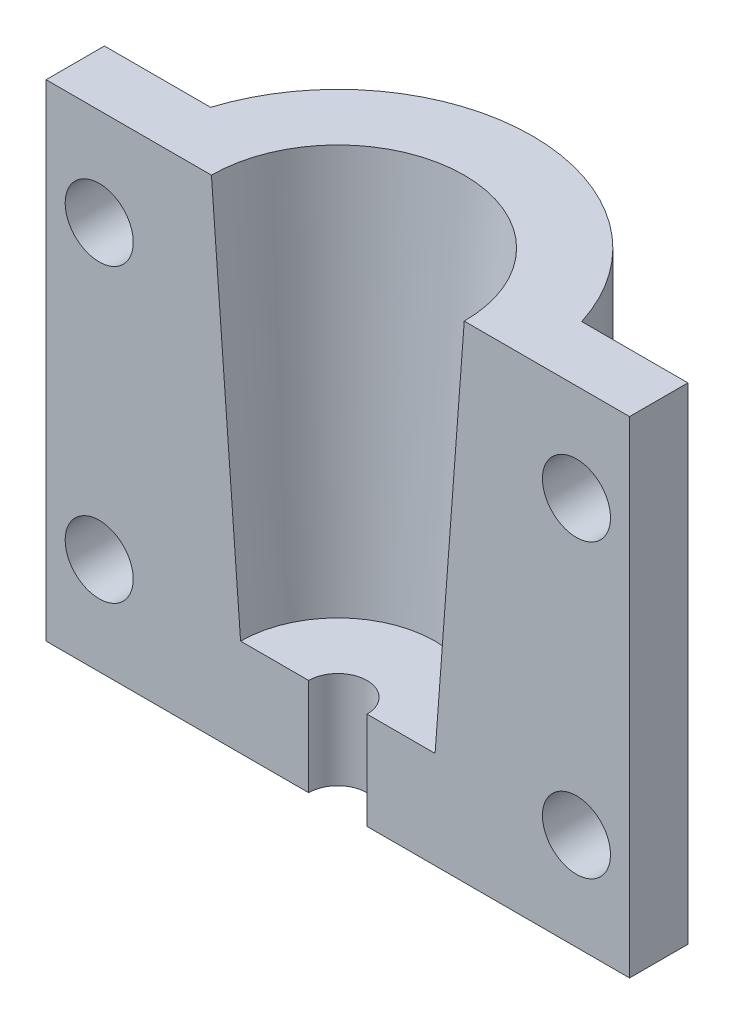
ISO-10303-21;
HEADER;
FILE_DESCRIPTION(('STEP AP214'),'2;1');
FILE_NAME('part.step','',(''),(''),'','','');
FILE_SCHEMA(('AUTOMOTIVE_DESIGN { 1 0 10303 214 1 1 1 1 }'));
ENDSEC;
DATA;
#1=APPLICATION_CONTEXT('core data for automotive mechanical design processes');
#2=APPLICATION_PROTOCOL_DEFINITION('international standard','automotive_design',2000,#1);
#3=PRODUCT_CONTEXT('',#1,'mechanical');
#4=PRODUCT('Part','Part','',(#3));
#5=PRODUCT_RELATED_PRODUCT_CATEGORY('part','',(#4));
#6=PRODUCT_DEFINITION_FORMATION('','',#4);
#7=PRODUCT_DEFINITION_CONTEXT('part definition',#1,'design');
#8=PRODUCT_DEFINITION('design','',#6,#7);
#9=PRODUCT_DEFINITION_SHAPE('','',#8);
#10=(LENGTH_UNIT() NAMED_UNIT(*) SI_UNIT(.MILLI.,.METRE.));
#11=(NAMED_UNIT(*) PLANE_ANGLE_UNIT() SI_UNIT($,.RADIAN.));
#12=(NAMED_UNIT(*) SI_UNIT($,.STERADIAN.) SOLID_ANGLE_UNIT());
#13=UNCERTAINTY_MEASURE_WITH_UNIT(LENGTH_MEASURE(1.E-05),#10,'distance_accuracy_value','');
#14=(GEOMETRIC_REPRESENTATION_CONTEXT(3) GLOBAL_UNCERTAINTY_ASSIGNED_CONTEXT((#13)) GLOBAL_UNIT_ASSIGNED_CONTEXT((#10,
#11,#12)) REPRESENTATION_CONTEXT('',''));
#15=CARTESIAN_POINT('',(0.,0.,0.));
#16=DIRECTION('',(0.,0.,1.));
#17=DIRECTION('',(1.,0.,0.));
#18=AXIS2_PLACEMENT_3D('',#15,#16,#17);
#19=CARTESIAN_POINT('',(0.,25.,0.));
#20=DIRECTION('',(0.,-1.,0.));
#21=DIRECTION('',(0.,0.,-1.));
#22=AXIS2_PLACEMENT_3D('',#19,#20,#21);
#23=CYLINDRICAL_SURFACE('',#22,10.);
#24=CARTESIAN_POINT('',(0.,25.,0.));
#25=DIRECTION('',(0.,1.,0.));
#26=DIRECTION('',(0.,0.,1.));
#27=AXIS2_PLACEMENT_3D('',#24,#25,#26);
#28=CIRCLE('',#27,10.);
#29=CARTESIAN_POINT('',(9.53939201416946,25.,-3.));
#30=VERTEX_POINT('',#29);
#31=CARTESIAN_POINT('',(-9.53939201416946,25.,-3.));
#32=VERTEX_POINT('',#31);
#33=EDGE_CURVE('E12',#30,#32,#28,.T.);
#34=ORIENTED_EDGE('',*,*,#33,.F.);
#35=DIRECTION('',(0.,-1.,0.));
#36=VECTOR('',#35,1.);
#37=CARTESIAN_POINT('',(9.53939201416946,25.,-3.));
#38=LINE('',#37,#36);
#39=CARTESIAN_POINT('',(9.53939201416946,0.,-3.));
#40=VERTEX_POINT('',#39);
#41=EDGE_CURVE('E165',#30,#40,#38,.T.);
#42=ORIENTED_EDGE('',*,*,#41,.T.);
#43=CARTESIAN_POINT('',(0.,0.,0.));
#44=DIRECTION('',(0.,1.,0.));
#45=DIRECTION('',(0.,0.,1.));
#46=AXIS2_PLACEMENT_3D('',#43,#44,#45);
#47=CIRCLE('',#46,10.);
#48=CARTESIAN_POINT('',(-9.53939201416946,0.,-3.));
#49=VERTEX_POINT('',#48);
#50=EDGE_CURVE('E76',#40,#49,#47,.T.);
#51=ORIENTED_EDGE('',*,*,#50,.T.);
#52=DIRECTION('',(0.,-1.,0.));
#53=VECTOR('',#52,1.);
#54=CARTESIAN_POINT('',(-9.53939201416946,25.,-3.));
#55=LINE('',#54,#53);
#56=EDGE_CURVE('E154',#32,#49,#55,.T.);
#57=ORIENTED_EDGE('',*,*,#56,.F.);
#58=EDGE_LOOP('',(#34,#42,#51,#57));
#59=FACE_BOUND('',#58,.T.);
#60=ADVANCED_FACE('F66',(#59),#23,.T.);
#61=CARTESIAN_POINT('',(0.,25.,0.));
#62=DIRECTION('',(0.,1.,0.));
#63=DIRECTION('',(0.,0.,1.));
#64=AXIS2_PLACEMENT_3D('',#61,#62,#63);
#65=PLANE('',#64);
#66=CARTESIAN_POINT('',(0.,25.,0.));
#67=DIRECTION('',(0.,1.,0.));
#68=DIRECTION('',(0.,0.,1.));
#69=AXIS2_PLACEMENT_3D('',#66,#67,#68);
#70=CIRCLE('',#69,6.5);
#71=CARTESIAN_POINT('',(-6.5,25.,0.));
#72=VERTEX_POINT('',#71);
#73=CARTESIAN_POINT('',(6.5,25.,0.));
#74=VERTEX_POINT('',#73);
#75=EDGE_CURVE('E69',#72,#74,#70,.F.);
#76=ORIENTED_EDGE('',*,*,#75,.T.);
#77=DIRECTION('',(-1.,0.,0.));
#78=VECTOR('',#77,1.);
#79=CARTESIAN_POINT('',(1.5,25.,0.));
#80=LINE('',#79,#78);
#81=CARTESIAN_POINT('',(15.,25.,0.));
#82=VERTEX_POINT('',#81);
#83=EDGE_CURVE('E142',#82,#74,#80,.T.);
#84=ORIENTED_EDGE('',*,*,#83,.F.);
#85=DIRECTION('',(0.,0.,1.));
#86=VECTOR('',#85,1.);
#87=CARTESIAN_POINT('',(15.,25.,0.));
#88=LINE('',#87,#86);
#89=CARTESIAN_POINT('',(15.,25.,-3.));
#90=VERTEX_POINT('',#89);
#91=EDGE_CURVE('E146',#90,#82,#88,.T.);
#92=ORIENTED_EDGE('',*,*,#91,.F.);
#93=DIRECTION('',(1.,0.,0.));
#94=VECTOR('',#93,1.);
#95=CARTESIAN_POINT('',(8.75129931987886,25.,-3.));
#96=LINE('',#95,#94);
#97=EDGE_CURVE('E172',#30,#90,#96,.T.);
#98=ORIENTED_EDGE('',*,*,#97,.F.);
#99=ORIENTED_EDGE('',*,*,#33,.T.);
#100=DIRECTION('',(-1.,0.,0.));
#101=VECTOR('',#100,1.);
#102=CARTESIAN_POINT('',(-8.75129931987886,25.,-3.));
#103=LINE('',#102,#101);
#104=CARTESIAN_POINT('',(-15.,25.,-3.));
#105=VERTEX_POINT('',#104);
#106=EDGE_CURVE('E207',#32,#105,#103,.T.);
#107=ORIENTED_EDGE('',*,*,#106,.T.);
#108=DIRECTION('',(0.,0.,1.));
#109=VECTOR('',#108,1.);
#110=CARTESIAN_POINT('',(-15.,25.,0.));
#111=LINE('',#110,#109);
#112=CARTESIAN_POINT('',(-15.,25.,0.));
#113=VERTEX_POINT('',#112);
#114=EDGE_CURVE('E210',#105,#113,#111,.T.);
#115=ORIENTED_EDGE('',*,*,#114,.T.);
#116=DIRECTION('',(-1.,0.,0.));
#117=VECTOR('',#116,1.);
#118=CARTESIAN_POINT('',(-10.,25.,0.));
#119=LINE('',#118,#117);
#120=EDGE_CURVE('E153',#72,#113,#119,.T.);
#121=ORIENTED_EDGE('',*,*,#120,.F.);
#122=EDGE_LOOP('',(#76,#84,#92,#98,#99,#107,#115,#121));
#123=FACE_BOUND('',#122,.T.);
#124=ADVANCED_FACE('F144',(#123),#65,.T.);
#125=CARTESIAN_POINT('',(0.,0.,0.));
#126=DIRECTION('',(0.,1.,0.));
#127=DIRECTION('',(0.,0.,1.));
#128=AXIS2_PLACEMENT_3D('',#125,#126,#127);
#129=PLANE('',#128);
#130=DIRECTION('',(-1.,0.,0.));
#131=VECTOR('',#130,1.);
#132=CARTESIAN_POINT('',(1.5,0.,0.));
#133=LINE('',#132,#131);
#134=CARTESIAN_POINT('',(15.,0.,0.));
#135=VERTEX_POINT('',#134);
#136=CARTESIAN_POINT('',(1.5,0.,0.));
#137=VERTEX_POINT('',#136);
#138=EDGE_CURVE('E160',#135,#137,#133,.T.);
#139=ORIENTED_EDGE('',*,*,#138,.T.);
#140=CARTESIAN_POINT('',(0.,0.,0.));
#141=DIRECTION('',(0.,1.,0.));
#142=DIRECTION('',(0.,0.,-1.));
#143=AXIS2_PLACEMENT_3D('',#140,#141,#142);
#144=CIRCLE('',#143,1.5);
#145=CARTESIAN_POINT('',(-1.5,0.,0.));
#146=VERTEX_POINT('',#145);
#147=EDGE_CURVE('E233',#137,#146,#144,.T.);
#148=ORIENTED_EDGE('',*,*,#147,.T.);
#149=DIRECTION('',(-1.,0.,0.));
#150=VECTOR('',#149,1.);
#151=CARTESIAN_POINT('',(-10.,0.,0.));
#152=LINE('',#151,#150);
#153=CARTESIAN_POINT('',(-15.,0.,0.));
#154=VERTEX_POINT('',#153);
#155=EDGE_CURVE('E237',#146,#154,#152,.T.);
#156=ORIENTED_EDGE('',*,*,#155,.T.);
#157=DIRECTION('',(0.,0.,1.));
#158=VECTOR('',#157,1.);
#159=CARTESIAN_POINT('',(-15.,0.,0.));
#160=LINE('',#159,#158);
#161=CARTESIAN_POINT('',(-15.,0.,-3.));
#162=VERTEX_POINT('',#161);
#163=EDGE_CURVE('E211',#162,#154,#160,.T.);
#164=ORIENTED_EDGE('',*,*,#163,.F.);
#165=DIRECTION('',(-1.,0.,0.));
#166=VECTOR('',#165,1.);
#167=CARTESIAN_POINT('',(-8.75129931987886,0.,-3.));
#168=LINE('',#167,#166);
#169=EDGE_CURVE('E206',#49,#162,#168,.T.);
#170=ORIENTED_EDGE('',*,*,#169,.F.);
#171=ORIENTED_EDGE('',*,*,#50,.F.);
#172=DIRECTION('',(1.,0.,0.));
#173=VECTOR('',#172,1.);
#174=CARTESIAN_POINT('',(8.75129931987886,0.,-3.));
#175=LINE('',#174,#173);
#176=CARTESIAN_POINT('',(15.,0.,-3.));
#177=VERTEX_POINT('',#176);
#178=EDGE_CURVE('E173',#40,#177,#175,.T.);
#179=ORIENTED_EDGE('',*,*,#178,.T.);
#180=DIRECTION('',(0.,0.,1.));
#181=VECTOR('',#180,1.);
#182=CARTESIAN_POINT('',(15.,0.,0.));
#183=LINE('',#182,#181);
#184=EDGE_CURVE('E178',#177,#135,#183,.T.);
#185=ORIENTED_EDGE('',*,*,#184,.T.);
#186=EDGE_LOOP('',(#139,#148,#156,#164,#170,#171,#179,#185));
#187=FACE_BOUND('',#186,.T.);
#188=ADVANCED_FACE('F293',(#187),#129,.F.);
#189=CARTESIAN_POINT('',(0.,5.,0.));
#190=DIRECTION('',(0.,1.,0.));
#191=DIRECTION('',(0.,0.,1.));
#192=AXIS2_PLACEMENT_3D('',#189,#190,#191);
#193=CONICAL_SURFACE('',#192,5.,0.0748598477107669);
#194=ORIENTED_EDGE('',*,*,#75,.F.);
#195=DIRECTION('',(-0.0747899482416342,0.997199309888456,0.));
#196=VECTOR('',#195,1.);
#197=CARTESIAN_POINT('',(0.,-61.6666666666667,0.));
#198=LINE('',#197,#196);
#199=CARTESIAN_POINT('',(-5.00008660902664,5.,1.66282445557137E-07));
#200=VERTEX_POINT('',#199);
#201=EDGE_CURVE('E266',#72,#200,#198,.F.);
#202=ORIENTED_EDGE('',*,*,#201,.T.);
#203=CARTESIAN_POINT('',(0.,5.,0.));
#204=DIRECTION('',(0.,1.,0.));
#205=DIRECTION('',(0.,0.,1.));
#206=AXIS2_PLACEMENT_3D('',#203,#204,#205);
#207=CIRCLE('',#206,5.);
#208=CARTESIAN_POINT('',(5.00008660984891,5.,-1.67465395592363E-07));
#209=VERTEX_POINT('',#208);
#210=EDGE_CURVE('E272',#200,#209,#207,.F.);
#211=ORIENTED_EDGE('',*,*,#210,.T.);
#212=DIRECTION('',(-0.0747899482416342,-0.997199309888456,0.));
#213=VECTOR('',#212,1.);
#214=CARTESIAN_POINT('',(0.,-61.6666666666667,0.));
#215=LINE('',#214,#213);
#216=EDGE_CURVE('E255',#209,#74,#215,.F.);
#217=ORIENTED_EDGE('',*,*,#216,.T.);
#218=EDGE_LOOP('',(#194,#202,#211,#217));
#219=FACE_BOUND('',#218,.T.);
#220=ADVANCED_FACE('F282',(#219),#193,.F.);
#221=CARTESIAN_POINT('',(0.,5.,0.));
#222=DIRECTION('',(0.,-1.,0.));
#223=DIRECTION('',(0.,0.,-1.));
#224=AXIS2_PLACEMENT_3D('',#221,#222,#223);
#225=PLANE('',#224);
#226=ORIENTED_EDGE('',*,*,#210,.F.);
#227=DIRECTION('',(1.,0.,0.));
#228=VECTOR('',#227,1.);
#229=CARTESIAN_POINT('',(0.,5.,0.));
#230=LINE('',#229,#228);
#231=CARTESIAN_POINT('',(-1.5,5.,0.));
#232=VERTEX_POINT('',#231);
#233=EDGE_CURVE('E260',#200,#232,#230,.T.);
#234=ORIENTED_EDGE('',*,*,#233,.T.);
#235=CARTESIAN_POINT('',(0.,5.,0.));
#236=DIRECTION('',(0.,-1.,0.));
#237=DIRECTION('',(0.,0.,-1.));
#238=AXIS2_PLACEMENT_3D('',#235,#236,#237);
#239=CIRCLE('',#238,1.5);
#240=CARTESIAN_POINT('',(1.5,5.,0.));
#241=VERTEX_POINT('',#240);
#242=EDGE_CURVE('E247',#232,#241,#239,.T.);
#243=ORIENTED_EDGE('',*,*,#242,.T.);
#244=DIRECTION('',(1.,0.,0.));
#245=VECTOR('',#244,1.);
#246=CARTESIAN_POINT('',(0.,5.,0.));
#247=LINE('',#246,#245);
#248=EDGE_CURVE('E251',#241,#209,#247,.T.);
#249=ORIENTED_EDGE('',*,*,#248,.T.);
#250=EDGE_LOOP('',(#226,#234,#243,#249));
#251=FACE_BOUND('',#250,.T.);
#252=ADVANCED_FACE('F292',(#251),#225,.F.);
#253=CARTESIAN_POINT('',(-10.,0.,0.));
#254=DIRECTION('',(0.,0.,-1.));
#255=DIRECTION('',(-1.,0.,0.));
#256=AXIS2_PLACEMENT_3D('',#253,#254,#255);
#257=PLANE('',#256);
#258=CARTESIAN_POINT('',(-12.2696960070847,5.,0.));
#259=DIRECTION('',(0.,0.,-1.));
#260=DIRECTION('',(-1.,0.,0.));
#261=AXIS2_PLACEMENT_3D('',#258,#259,#260);
#262=CIRCLE('',#261,1.75);
#263=CARTESIAN_POINT('',(-14.0196960070847,5.,0.));
#264=VERTEX_POINT('',#263);
#265=EDGE_CURVE('E202',#264,#264,#262,.T.);
#266=ORIENTED_EDGE('',*,*,#265,.T.);
#267=EDGE_LOOP('',(#266));
#268=FACE_BOUND('',#267,.T.);
#269=CARTESIAN_POINT('',(-12.2696960070847,20.,0.));
#270=DIRECTION('',(0.,0.,-1.));
#271=DIRECTION('',(-1.,0.,0.));
#272=AXIS2_PLACEMENT_3D('',#269,#270,#271);
#273=CIRCLE('',#272,1.75);
#274=CARTESIAN_POINT('',(-14.0196960070847,20.,0.));
#275=VERTEX_POINT('',#274);
#276=EDGE_CURVE('E195',#275,#275,#273,.T.);
#277=ORIENTED_EDGE('',*,*,#276,.T.);
#278=EDGE_LOOP('',(#277));
#279=FACE_BOUND('',#278,.T.);
#280=DIRECTION('',(0.,-1.,0.));
#281=VECTOR('',#280,1.);
#282=CARTESIAN_POINT('',(-15.,25.,0.));
#283=LINE('',#282,#281);
#284=EDGE_CURVE('E215',#113,#154,#283,.T.);
#285=ORIENTED_EDGE('',*,*,#284,.T.);
#286=ORIENTED_EDGE('',*,*,#155,.F.);
#287=DIRECTION('',(0.,1.,0.));
#288=VECTOR('',#287,1.);
#289=CARTESIAN_POINT('',(-1.5,0.,0.));
#290=LINE('',#289,#288);
#291=EDGE_CURVE('E326',#146,#232,#290,.T.);
#292=ORIENTED_EDGE('',*,*,#291,.T.);
#293=ORIENTED_EDGE('',*,*,#233,.F.);
#294=ORIENTED_EDGE('',*,*,#201,.F.);
#295=ORIENTED_EDGE('',*,*,#120,.T.);
#296=EDGE_LOOP('',(#285,#286,#292,#293,#294,#295));
#297=FACE_BOUND('',#296,.T.);
#298=ADVANCED_FACE('F336',(#268,#279,#297),#257,.F.);
#299=CARTESIAN_POINT('',(1.5,0.,0.));
#300=DIRECTION('',(0.,0.,-1.));
#301=DIRECTION('',(-1.,0.,0.));
#302=AXIS2_PLACEMENT_3D('',#299,#300,#301);
#303=PLANE('',#302);
#304=CARTESIAN_POINT('',(12.2696960070847,5.,0.));
#305=DIRECTION('',(0.,0.,-1.));
#306=DIRECTION('',(-1.,0.,0.));
#307=AXIS2_PLACEMENT_3D('',#304,#305,#306);
#308=CIRCLE('',#307,1.75);
#309=CARTESIAN_POINT('',(10.5196960070847,5.,0.));
#310=VERTEX_POINT('',#309);
#311=EDGE_CURVE('E181',#310,#310,#308,.F.);
#312=ORIENTED_EDGE('',*,*,#311,.F.);
#313=EDGE_LOOP('',(#312));
#314=FACE_BOUND('',#313,.T.);
#315=CARTESIAN_POINT('',(12.2696960070847,20.,0.));
#316=DIRECTION('',(0.,0.,-1.));
#317=DIRECTION('',(-1.,0.,0.));
#318=AXIS2_PLACEMENT_3D('',#315,#316,#317);
#319=CIRCLE('',#318,1.75);
#320=CARTESIAN_POINT('',(10.5196960070847,20.,0.));
#321=VERTEX_POINT('',#320);
#322=EDGE_CURVE('E538',#321,#321,#319,.F.);
#323=ORIENTED_EDGE('',*,*,#322,.F.);
#324=EDGE_LOOP('',(#323));
#325=FACE_BOUND('',#324,.T.);
#326=DIRECTION('',(0.,1.,0.));
#327=VECTOR('',#326,1.);
#328=CARTESIAN_POINT('',(1.5,0.,0.));
#329=LINE('',#328,#327);
#330=EDGE_CURVE('E240',#137,#241,#329,.T.);
#331=ORIENTED_EDGE('',*,*,#330,.F.);
#332=ORIENTED_EDGE('',*,*,#138,.F.);
#333=DIRECTION('',(0.,-1.,0.));
#334=VECTOR('',#333,1.);
#335=CARTESIAN_POINT('',(15.,25.,0.));
#336=LINE('',#335,#334);
#337=EDGE_CURVE('E157',#82,#135,#336,.T.);
#338=ORIENTED_EDGE('',*,*,#337,.F.);
#339=ORIENTED_EDGE('',*,*,#83,.T.);
#340=ORIENTED_EDGE('',*,*,#216,.F.);
#341=ORIENTED_EDGE('',*,*,#248,.F.);
#342=EDGE_LOOP('',(#331,#332,#338,#339,#340,#341));
#343=FACE_BOUND('',#342,.T.);
#344=ADVANCED_FACE('F159',(#314,#325,#343),#303,.F.);
#345=CARTESIAN_POINT('',(0.,0.,0.));
#346=DIRECTION('',(0.,1.,0.));
#347=DIRECTION('',(0.,0.,1.));
#348=AXIS2_PLACEMENT_3D('',#345,#346,#347);
#349=CYLINDRICAL_SURFACE('',#348,1.5);
#350=ORIENTED_EDGE('',*,*,#291,.F.);
#351=ORIENTED_EDGE('',*,*,#147,.F.);
#352=ORIENTED_EDGE('',*,*,#330,.T.);
#353=ORIENTED_EDGE('',*,*,#242,.F.);
#354=EDGE_LOOP('',(#350,#351,#352,#353));
#355=FACE_BOUND('',#354,.T.);
#356=ADVANCED_FACE('F332',(#355),#349,.F.);
#357=CARTESIAN_POINT('',(-8.75129931987886,25.,-3.));
#358=DIRECTION('',(0.,0.,1.));
#359=DIRECTION('',(1.,0.,0.));
#360=AXIS2_PLACEMENT_3D('',#357,#358,#359);
#361=PLANE('',#360);
#362=CARTESIAN_POINT('',(-12.2696960070847,5.,-3.));
#363=DIRECTION('',(0.,0.,-1.));
#364=DIRECTION('',(-1.,0.,0.));
#365=AXIS2_PLACEMENT_3D('',#362,#363,#364);
#366=CIRCLE('',#365,1.75);
#367=CARTESIAN_POINT('',(-14.0196960070847,5.,-3.));
#368=VERTEX_POINT('',#367);
#369=EDGE_CURVE('E191',#368,#368,#366,.T.);
#370=ORIENTED_EDGE('',*,*,#369,.F.);
#371=EDGE_LOOP('',(#370));
#372=FACE_BOUND('',#371,.T.);
#373=CARTESIAN_POINT('',(-12.2696960070847,20.,-3.));
#374=DIRECTION('',(0.,0.,-1.));
#375=DIRECTION('',(-1.,0.,0.));
#376=AXIS2_PLACEMENT_3D('',#373,#374,#375);
#377=CIRCLE('',#376,1.75);
#378=CARTESIAN_POINT('',(-14.0196960070847,20.,-3.));
#379=VERTEX_POINT('',#378);
#380=EDGE_CURVE('E190',#379,#379,#377,.T.);
#381=ORIENTED_EDGE('',*,*,#380,.F.);
#382=EDGE_LOOP('',(#381));
#383=FACE_BOUND('',#382,.T.);
#384=ORIENTED_EDGE('',*,*,#106,.F.);
#385=ORIENTED_EDGE('',*,*,#56,.T.);
#386=ORIENTED_EDGE('',*,*,#169,.T.);
#387=DIRECTION('',(0.,-1.,0.));
#388=VECTOR('',#387,1.);
#389=CARTESIAN_POINT('',(-15.,25.,-3.));
#390=LINE('',#389,#388);
#391=EDGE_CURVE('E224',#105,#162,#390,.T.);
#392=ORIENTED_EDGE('',*,*,#391,.F.);
#393=EDGE_LOOP('',(#384,#385,#386,#392));
#394=FACE_BOUND('',#393,.T.);
#395=ADVANCED_FACE('F385',(#372,#383,#394),#361,.F.);
#396=CARTESIAN_POINT('',(-15.,25.,0.));
#397=DIRECTION('',(1.,0.,0.));
#398=DIRECTION('',(0.,0.,-1.));
#399=AXIS2_PLACEMENT_3D('',#396,#397,#398);
#400=PLANE('',#399);
#401=ORIENTED_EDGE('',*,*,#163,.T.);
#402=ORIENTED_EDGE('',*,*,#284,.F.);
#403=ORIENTED_EDGE('',*,*,#114,.F.);
#404=ORIENTED_EDGE('',*,*,#391,.T.);
#405=EDGE_LOOP('',(#401,#402,#403,#404));
#406=FACE_BOUND('',#405,.T.);
#407=ADVANCED_FACE('F391',(#406),#400,.F.);
#408=CARTESIAN_POINT('',(-12.2696960070847,20.,0.00204396637528033));
#409=DIRECTION('',(0.,0.,-1.));
#410=DIRECTION('',(-1.,0.,0.));
#411=AXIS2_PLACEMENT_3D('',#408,#409,#410);
#412=CYLINDRICAL_SURFACE('',#411,1.75);
#413=CARTESIAN_POINT('',(-14.0196960070847,20.,-3.));
#414=CARTESIAN_POINT('',(-14.0196960070847,20.,-2.96875));
#415=CARTESIAN_POINT('',(-14.0196960070847,20.,-2.9375));
#416=CARTESIAN_POINT('',(-14.0196960070847,20.,-2.875));
#417=CARTESIAN_POINT('',(-14.0196960070847,20.,-2.84375));
#418=CARTESIAN_POINT('',(-14.0196960070847,20.,-2.78125));
#419=CARTESIAN_POINT('',(-14.0196960070847,20.,-2.75));
#420=CARTESIAN_POINT('',(-14.0196960070847,20.,-2.6875));
#421=CARTESIAN_POINT('',(-14.0196960070847,20.,-2.65625));
#422=CARTESIAN_POINT('',(-14.0196960070847,20.,-2.59375));
#423=CARTESIAN_POINT('',(-14.0196960070847,20.,-2.5625));
#424=CARTESIAN_POINT('',(-14.0196960070847,20.,-2.5));
#425=CARTESIAN_POINT('',(-14.0196960070847,20.,-2.46875));
#426=CARTESIAN_POINT('',(-14.0196960070847,20.,-2.40625));
#427=CARTESIAN_POINT('',(-14.0196960070847,20.,-2.375));
#428=CARTESIAN_POINT('',(-14.0196960070847,20.,-2.3125));
#429=CARTESIAN_POINT('',(-14.0196960070847,20.,-2.28125));
#430=CARTESIAN_POINT('',(-14.0196960070847,20.,-2.21875));
#431=CARTESIAN_POINT('',(-14.0196960070847,20.,-2.1875));
#432=CARTESIAN_POINT('',(-14.0196960070847,20.,-2.125));
#433=CARTESIAN_POINT('',(-14.0196960070847,20.,-2.09375));
#434=CARTESIAN_POINT('',(-14.0196960070847,20.,-2.03125));
#435=CARTESIAN_POINT('',(-14.0196960070847,20.,-2.));
#436=CARTESIAN_POINT('',(-14.0196960070847,20.,-1.9375));
#437=CARTESIAN_POINT('',(-14.0196960070847,20.,-1.90625));
#438=CARTESIAN_POINT('',(-14.0196960070847,20.,-1.84375));
#439=CARTESIAN_POINT('',(-14.0196960070847,20.,-1.8125));
#440=CARTESIAN_POINT('',(-14.0196960070847,20.,-1.75));
#441=CARTESIAN_POINT('',(-14.0196960070847,20.,-1.71875));
#442=CARTESIAN_POINT('',(-14.0196960070847,20.,-1.65625));
#443=CARTESIAN_POINT('',(-14.0196960070847,20.,-1.625));
#444=CARTESIAN_POINT('',(-14.0196960070847,20.,-1.5625));
#445=CARTESIAN_POINT('',(-14.0196960070847,20.,-1.53125));
#446=CARTESIAN_POINT('',(-14.0196960070847,20.,-1.46875));
#447=CARTESIAN_POINT('',(-14.0196960070847,20.,-1.4375));
#448=CARTESIAN_POINT('',(-14.0196960070847,20.,-1.375));
#449=CARTESIAN_POINT('',(-14.0196960070847,20.,-1.34375));
#450=CARTESIAN_POINT('',(-14.0196960070847,20.,-1.28125));
#451=CARTESIAN_POINT('',(-14.0196960070847,20.,-1.25));
#452=CARTESIAN_POINT('',(-14.0196960070847,20.,-1.1875));
#453=CARTESIAN_POINT('',(-14.0196960070847,20.,-1.15625));
#454=CARTESIAN_POINT('',(-14.0196960070847,20.,-1.09375));
#455=CARTESIAN_POINT('',(-14.0196960070847,20.,-1.0625));
#456=CARTESIAN_POINT('',(-14.0196960070847,20.,-1.));
#457=CARTESIAN_POINT('',(-14.0196960070847,20.,-0.96875));
#458=CARTESIAN_POINT('',(-14.0196960070847,20.,-0.90625));
#459=CARTESIAN_POINT('',(-14.0196960070847,20.,-0.875));
#460=CARTESIAN_POINT('',(-14.0196960070847,20.,-0.8125));
#461=CARTESIAN_POINT('',(-14.0196960070847,20.,-0.78125));
#462=CARTESIAN_POINT('',(-14.0196960070847,20.,-0.71875));
#463=CARTESIAN_POINT('',(-14.0196960070847,20.,-0.6875));
#464=CARTESIAN_POINT('',(-14.0196960070847,20.,-0.625));
#465=CARTESIAN_POINT('',(-14.0196960070847,20.,-0.59375));
#466=CARTESIAN_POINT('',(-14.0196960070847,20.,-0.53125));
#467=CARTESIAN_POINT('',(-14.0196960070847,20.,-0.5));
#468=CARTESIAN_POINT('',(-14.0196960070847,20.,-0.4375));
#469=CARTESIAN_POINT('',(-14.0196960070847,20.,-0.40625));
#470=CARTESIAN_POINT('',(-14.0196960070847,20.,-0.34375));
#471=CARTESIAN_POINT('',(-14.0196960070847,20.,-0.3125));
#472=CARTESIAN_POINT('',(-14.0196960070847,20.,-0.25));
#473=CARTESIAN_POINT('',(-14.0196960070847,20.,-0.21875));
#474=CARTESIAN_POINT('',(-14.0196960070847,20.,-0.15625));
#475=CARTESIAN_POINT('',(-14.0196960070847,20.,-0.125));
#476=CARTESIAN_POINT('',(-14.0196960070847,20.,-0.0625000000000001));
#477=CARTESIAN_POINT('',(-14.0196960070847,20.,-0.0312500000000001));
#478=CARTESIAN_POINT('',(-14.0196960070847,20.,0.));
#479=B_SPLINE_CURVE_WITH_KNOTS('',3,(#413,#414,#415,#416,#417,#418,#419,#420,#421,#422,#423,
#424,#425,#426,#427,#428,#429,#430,#431,#432,#433,#434,#435,#436,#437,#438,#439,#440,#441,#442,
#443,#444,#445,#446,#447,#448,#449,#450,#451,#452,#453,#454,#455,#456,#457,#458,#459,#460,#461,
#462,#463,#464,#465,#466,#467,#468,#469,#470,#471,#472,#473,#474,#475,#476,#477,#478),
.UNSPECIFIED.,.F.,.F.,(4,2,2,2,2,2,2,2,2,2,2,2,2,2,2,2,2,2,2,2,2,2,2,2,2,2,2,2,2,2,2,2,4),(0.,
0.0937500000000001,0.1875,0.28125,0.375,0.46875,0.5625,0.65625,0.75,0.84375,0.9375,1.03125,
1.125,1.21875,1.3125,1.40625,1.5,1.59375,1.6875,1.78125,1.875,1.96875,2.0625,2.15625,2.25,
2.34375,2.4375,2.53125,2.625,2.71875,2.8125,2.90625,3.),.UNSPECIFIED.);
#480=EDGE_CURVE('BSEAM399',#379,#275,#479,.T.);
#481=ORIENTED_EDGE('',*,*,#380,.T.);
#482=ORIENTED_EDGE('',*,*,#276,.F.);
#483=ORIENTED_EDGE('',*,*,#480,.T.);
#484=ORIENTED_EDGE('',*,*,#480,.F.);
#485=EDGE_LOOP('',(#481,#483,#482,#484));
#486=FACE_BOUND('',#485,.T.);
#487=ADVANCED_FACE('F399',(#486),#412,.F.);
#488=CARTESIAN_POINT('',(-12.2696960070847,5.,0.00204396637528033));
#489=DIRECTION('',(0.,0.,-1.));
#490=DIRECTION('',(-1.,0.,0.));
#491=AXIS2_PLACEMENT_3D('',#488,#489,#490);
#492=CYLINDRICAL_SURFACE('',#491,1.75);
#493=CARTESIAN_POINT('',(-14.0196960070847,5.,-3.));
#494=CARTESIAN_POINT('',(-14.0196960070847,5.,-2.96875));
#495=CARTESIAN_POINT('',(-14.0196960070847,5.,-2.9375));
#496=CARTESIAN_POINT('',(-14.0196960070847,5.,-2.875));
#497=CARTESIAN_POINT('',(-14.0196960070847,5.,-2.84375));
#498=CARTESIAN_POINT('',(-14.0196960070847,5.,-2.78125));
#499=CARTESIAN_POINT('',(-14.0196960070847,5.,-2.75));
#500=CARTESIAN_POINT('',(-14.0196960070847,5.,-2.6875));
#501=CARTESIAN_POINT('',(-14.0196960070847,5.,-2.65625));
#502=CARTESIAN_POINT('',(-14.0196960070847,5.,-2.59375));
#503=CARTESIAN_POINT('',(-14.0196960070847,5.,-2.5625));
#504=CARTESIAN_POINT('',(-14.0196960070847,5.,-2.5));
#505=CARTESIAN_POINT('',(-14.0196960070847,5.,-2.46875));
#506=CARTESIAN_POINT('',(-14.0196960070847,5.,-2.40625));
#507=CARTESIAN_POINT('',(-14.0196960070847,5.,-2.375));
#508=CARTESIAN_POINT('',(-14.0196960070847,5.,-2.3125));
#509=CARTESIAN_POINT('',(-14.0196960070847,5.,-2.28125));
#510=CARTESIAN_POINT('',(-14.0196960070847,5.,-2.21875));
#511=CARTESIAN_POINT('',(-14.0196960070847,5.,-2.1875));
#512=CARTESIAN_POINT('',(-14.0196960070847,5.,-2.125));
#513=CARTESIAN_POINT('',(-14.0196960070847,5.,-2.09375));
#514=CARTESIAN_POINT('',(-14.0196960070847,5.,-2.03125));
#515=CARTESIAN_POINT('',(-14.0196960070847,5.,-2.));
#516=CARTESIAN_POINT('',(-14.0196960070847,5.,-1.9375));
#517=CARTESIAN_POINT('',(-14.0196960070847,5.,-1.90625));
#518=CARTESIAN_POINT('',(-14.0196960070847,5.,-1.84375));
#519=CARTESIAN_POINT('',(-14.0196960070847,5.,-1.8125));
#520=CARTESIAN_POINT('',(-14.0196960070847,5.,-1.75));
#521=CARTESIAN_POINT('',(-14.0196960070847,5.,-1.71875));
#522=CARTESIAN_POINT('',(-14.0196960070847,5.,-1.65625));
#523=CARTESIAN_POINT('',(-14.0196960070847,5.,-1.625));
#524=CARTESIAN_POINT('',(-14.0196960070847,5.,-1.5625));
#525=CARTESIAN_POINT('',(-14.0196960070847,5.,-1.53125));
#526=CARTESIAN_POINT('',(-14.0196960070847,5.,-1.46875));
#527=CARTESIAN_POINT('',(-14.0196960070847,5.,-1.4375));
#528=CARTESIAN_POINT('',(-14.0196960070847,5.,-1.375));
#529=CARTESIAN_POINT('',(-14.0196960070847,5.,-1.34375));
#530=CARTESIAN_POINT('',(-14.0196960070847,5.,-1.28125));
#531=CARTESIAN_POINT('',(-14.0196960070847,5.,-1.25));
#532=CARTESIAN_POINT('',(-14.0196960070847,5.,-1.1875));
#533=CARTESIAN_POINT('',(-14.0196960070847,5.,-1.15625));
#534=CARTESIAN_POINT('',(-14.0196960070847,5.,-1.09375));
#535=CARTESIAN_POINT('',(-14.0196960070847,5.,-1.0625));
#536=CARTESIAN_POINT('',(-14.0196960070847,5.,-1.));
#537=CARTESIAN_POINT('',(-14.0196960070847,5.,-0.96875));
#538=CARTESIAN_POINT('',(-14.0196960070847,5.,-0.90625));
#539=CARTESIAN_POINT('',(-14.0196960070847,5.,-0.875));
#540=CARTESIAN_POINT('',(-14.0196960070847,5.,-0.8125));
#541=CARTESIAN_POINT('',(-14.0196960070847,5.,-0.78125));
#542=CARTESIAN_POINT('',(-14.0196960070847,5.,-0.71875));
#543=CARTESIAN_POINT('',(-14.0196960070847,5.,-0.6875));
#544=CARTESIAN_POINT('',(-14.0196960070847,5.,-0.625));
#545=CARTESIAN_POINT('',(-14.0196960070847,5.,-0.59375));
#546=CARTESIAN_POINT('',(-14.0196960070847,5.,-0.53125));
#547=CARTESIAN_POINT('',(-14.0196960070847,5.,-0.5));
#548=CARTESIAN_POINT('',(-14.0196960070847,5.,-0.4375));
#549=CARTESIAN_POINT('',(-14.0196960070847,5.,-0.40625));
#550=CARTESIAN_POINT('',(-14.0196960070847,5.,-0.34375));
#551=CARTESIAN_POINT('',(-14.0196960070847,5.,-0.3125));
#552=CARTESIAN_POINT('',(-14.0196960070847,5.,-0.25));
#553=CARTESIAN_POINT('',(-14.0196960070847,5.,-0.21875));
#554=CARTESIAN_POINT('',(-14.0196960070847,5.,-0.15625));
#555=CARTESIAN_POINT('',(-14.0196960070847,5.,-0.125));
#556=CARTESIAN_POINT('',(-14.0196960070847,5.,-0.0625000000000001));
#557=CARTESIAN_POINT('',(-14.0196960070847,5.,-0.0312500000000001));
#558=CARTESIAN_POINT('',(-14.0196960070847,5.,0.));
#559=B_SPLINE_CURVE_WITH_KNOTS('',3,(#493,#494,#495,#496,#497,#498,#499,#500,#501,#502,#503,
#504,#505,#506,#507,#508,#509,#510,#511,#512,#513,#514,#515,#516,#517,#518,#519,#520,#521,#522,
#523,#524,#525,#526,#527,#528,#529,#530,#531,#532,#533,#534,#535,#536,#537,#538,#539,#540,#541,
#542,#543,#544,#545,#546,#547,#548,#549,#550,#551,#552,#553,#554,#555,#556,#557,#558),
.UNSPECIFIED.,.F.,.F.,(4,2,2,2,2,2,2,2,2,2,2,2,2,2,2,2,2,2,2,2,2,2,2,2,2,2,2,2,2,2,2,2,4),(0.,
0.0937500000000001,0.1875,0.28125,0.375,0.46875,0.5625,0.65625,0.75,0.84375,0.9375,1.03125,
1.125,1.21875,1.3125,1.40625,1.5,1.59375,1.6875,1.78125,1.875,1.96875,2.0625,2.15625,2.25,
2.34375,2.4375,2.53125,2.625,2.71875,2.8125,2.90625,3.),.UNSPECIFIED.);
#560=EDGE_CURVE('BSEAM406',#368,#264,#559,.T.);
#561=ORIENTED_EDGE('',*,*,#369,.T.);
#562=ORIENTED_EDGE('',*,*,#265,.F.);
#563=ORIENTED_EDGE('',*,*,#560,.T.);
#564=ORIENTED_EDGE('',*,*,#560,.F.);
#565=EDGE_LOOP('',(#561,#563,#562,#564));
#566=FACE_BOUND('',#565,.T.);
#567=ADVANCED_FACE('F406',(#566),#492,.F.);
#568=CARTESIAN_POINT('',(8.75129931987886,25.,-3.));
#569=DIRECTION('',(0.,0.,-1.));
#570=DIRECTION('',(-1.,0.,0.));
#571=AXIS2_PLACEMENT_3D('',#568,#569,#570);
#572=PLANE('',#571);
#573=CARTESIAN_POINT('',(12.2696960070847,5.,-3.));
#574=DIRECTION('',(0.,0.,1.));
#575=DIRECTION('',(1.,0.,0.));
#576=AXIS2_PLACEMENT_3D('',#573,#574,#575);
#577=CIRCLE('',#576,1.75);
#578=CARTESIAN_POINT('',(14.0196960070847,5.,-3.));
#579=VERTEX_POINT('',#578);
#580=EDGE_CURVE('E534',#579,#579,#577,.T.);
#581=ORIENTED_EDGE('',*,*,#580,.T.);
#582=EDGE_LOOP('',(#581));
#583=FACE_BOUND('',#582,.T.);
#584=CARTESIAN_POINT('',(12.2696960070847,20.,-3.));
#585=DIRECTION('',(0.,0.,1.));
#586=DIRECTION('',(1.,0.,0.));
#587=AXIS2_PLACEMENT_3D('',#584,#585,#586);
#588=CIRCLE('',#587,1.75);
#589=CARTESIAN_POINT('',(14.0196960070847,20.,-3.));
#590=VERTEX_POINT('',#589);
#591=EDGE_CURVE('E544',#590,#590,#588,.T.);
#592=ORIENTED_EDGE('',*,*,#591,.T.);
#593=EDGE_LOOP('',(#592));
#594=FACE_BOUND('',#593,.T.);
#595=ORIENTED_EDGE('',*,*,#41,.F.);
#596=ORIENTED_EDGE('',*,*,#97,.T.);
#597=DIRECTION('',(0.,-1.,0.));
#598=VECTOR('',#597,1.);
#599=CARTESIAN_POINT('',(15.,25.,-3.));
#600=LINE('',#599,#598);
#601=EDGE_CURVE('E166',#90,#177,#600,.T.);
#602=ORIENTED_EDGE('',*,*,#601,.T.);
#603=ORIENTED_EDGE('',*,*,#178,.F.);
#604=EDGE_LOOP('',(#595,#596,#602,#603));
#605=FACE_BOUND('',#604,.T.);
#606=ADVANCED_FACE('F344',(#583,#594,#605),#572,.T.);
#607=CARTESIAN_POINT('',(15.,25.,0.));
#608=DIRECTION('',(1.,0.,0.));
#609=DIRECTION('',(0.,0.,-1.));
#610=AXIS2_PLACEMENT_3D('',#607,#608,#609);
#611=PLANE('',#610);
#612=ORIENTED_EDGE('',*,*,#184,.F.);
#613=ORIENTED_EDGE('',*,*,#601,.F.);
#614=ORIENTED_EDGE('',*,*,#91,.T.);
#615=ORIENTED_EDGE('',*,*,#337,.T.);
#616=EDGE_LOOP('',(#612,#613,#614,#615));
#617=FACE_BOUND('',#616,.T.);
#618=ADVANCED_FACE('F169',(#617),#611,.T.);
#619=CARTESIAN_POINT('',(12.2696960070847,20.,0.0020439663752812));
#620=DIRECTION('',(0.,0.,-1.));
#621=DIRECTION('',(-1.,0.,0.));
#622=AXIS2_PLACEMENT_3D('',#619,#620,#621);
#623=CYLINDRICAL_SURFACE('',#622,1.75);
#624=ORIENTED_EDGE('',*,*,#591,.F.);
#625=EDGE_LOOP('',(#624));
#626=FACE_BOUND('',#625,.T.);
#627=ORIENTED_EDGE('',*,*,#322,.T.);
#628=EDGE_LOOP('',(#627));
#629=FACE_BOUND('',#628,.T.);
#630=ADVANCED_FACE('F427',(#626,#629),#623,.F.);
#631=CARTESIAN_POINT('',(12.2696960070847,5.,0.0020439663752812));
#632=DIRECTION('',(0.,0.,-1.));
#633=DIRECTION('',(-1.,0.,0.));
#634=AXIS2_PLACEMENT_3D('',#631,#632,#633);
#635=CYLINDRICAL_SURFACE('',#634,1.75);
#636=ORIENTED_EDGE('',*,*,#580,.F.);
#637=EDGE_LOOP('',(#636));
#638=FACE_BOUND('',#637,.T.);
#639=ORIENTED_EDGE('',*,*,#311,.T.);
#640=EDGE_LOOP('',(#639));
#641=FACE_BOUND('',#640,.T.);
#642=ADVANCED_FACE('F434',(#638,#641),#635,.F.);
#643=CLOSED_SHELL('',(#60,#124,#188,#220,#252,#298,#344,#356,#395,#407,#487,#567,#606,#618,#630,#642));
#644=MANIFOLD_SOLID_BREP('B2',#643);
#645=ADVANCED_BREP_SHAPE_REPRESENTATION('',(#18,#644),#14);
#646=SHAPE_DEFINITION_REPRESENTATION(#9,#645);
ENDSEC;
END-ISO-10303-21;
